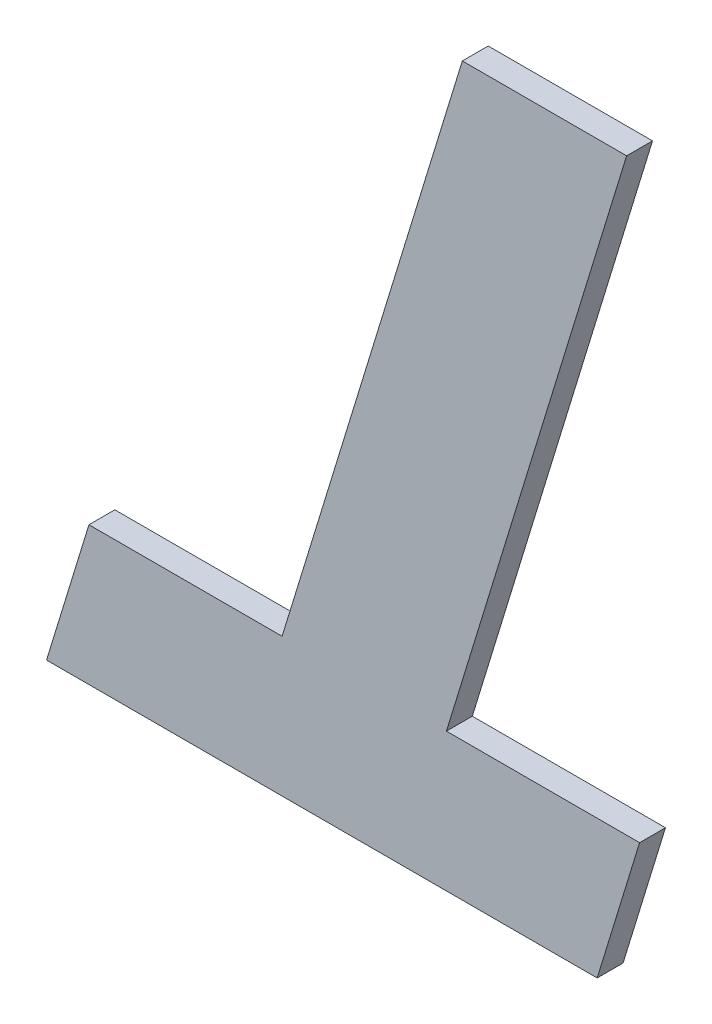
ISO-10303-21;
HEADER;
FILE_DESCRIPTION(('STEP AP214'),'2;1');
FILE_NAME('part.step','',(''),(''),'','','');
FILE_SCHEMA(('AUTOMOTIVE_DESIGN { 1 0 10303 214 1 1 1 1 }'));
ENDSEC;
DATA;
#1=APPLICATION_CONTEXT('core data for automotive mechanical design processes');
#2=APPLICATION_PROTOCOL_DEFINITION('international standard','automotive_design',2000,#1);
#3=PRODUCT_CONTEXT('',#1,'mechanical');
#4=PRODUCT('Part','Part','',(#3));
#5=PRODUCT_RELATED_PRODUCT_CATEGORY('part','',(#4));
#6=PRODUCT_DEFINITION_FORMATION('','',#4);
#7=PRODUCT_DEFINITION_CONTEXT('part definition',#1,'design');
#8=PRODUCT_DEFINITION('design','',#6,#7);
#9=PRODUCT_DEFINITION_SHAPE('','',#8);
#10=(LENGTH_UNIT() NAMED_UNIT(*) SI_UNIT(.MILLI.,.METRE.));
#11=(NAMED_UNIT(*) PLANE_ANGLE_UNIT() SI_UNIT($,.RADIAN.));
#12=(NAMED_UNIT(*) SI_UNIT($,.STERADIAN.) SOLID_ANGLE_UNIT());
#13=UNCERTAINTY_MEASURE_WITH_UNIT(LENGTH_MEASURE(1.E-05),#10,'distance_accuracy_value','');
#14=(GEOMETRIC_REPRESENTATION_CONTEXT(3) GLOBAL_UNCERTAINTY_ASSIGNED_CONTEXT((#13)) GLOBAL_UNIT_ASSIGNED_CONTEXT((#10,
#11,#12)) REPRESENTATION_CONTEXT('',''));
#15=CARTESIAN_POINT('',(0.,0.,0.));
#16=DIRECTION('',(0.,0.,1.));
#17=DIRECTION('',(1.,0.,0.));
#18=AXIS2_PLACEMENT_3D('',#15,#16,#17);
#19=CARTESIAN_POINT('',(0.507935009014504,-1.956156289871,0.));
#20=DIRECTION('',(0.,1.,0.));
#21=DIRECTION('',(-1.,0.,0.));
#22=AXIS2_PLACEMENT_3D('',#19,#20,#21);
#23=PLANE('',#22);
#24=DIRECTION('',(1.,0.,0.));
#25=VECTOR('',#24,1.);
#26=CARTESIAN_POINT('',(-0.238437801624394,-1.956156289871,0.));
#27=LINE('',#26,#25);
#28=CARTESIAN_POINT('',(-0.238437801624394,-1.956156289871,0.));
#29=VERTEX_POINT('',#28);
#30=CARTESIAN_POINT('',(0.507935009014504,-1.956156289871,0.));
#31=VERTEX_POINT('',#30);
#32=EDGE_CURVE('E11',#29,#31,#27,.T.);
#33=ORIENTED_EDGE('',*,*,#32,.F.);
#34=DIRECTION('',(0.,0.,1.));
#35=VECTOR('',#34,1.);
#36=CARTESIAN_POINT('',(-0.238437801624394,-1.956156289871,0.));
#37=LINE('',#36,#35);
#38=CARTESIAN_POINT('',(-0.238437801624394,-1.956156289871,0.1));
#39=VERTEX_POINT('',#38);
#40=EDGE_CURVE('E24',#29,#39,#37,.T.);
#41=ORIENTED_EDGE('',*,*,#40,.T.);
#42=DIRECTION('',(-1.,0.,0.));
#43=VECTOR('',#42,1.);
#44=CARTESIAN_POINT('',(-0.238437801624394,-1.956156289871,0.1));
#45=LINE('',#44,#43);
#46=CARTESIAN_POINT('',(0.507935009014504,-1.956156289871,0.1));
#47=VERTEX_POINT('',#46);
#48=EDGE_CURVE('E100',#47,#39,#45,.T.);
#49=ORIENTED_EDGE('',*,*,#48,.F.);
#50=DIRECTION('',(0.,0.,1.));
#51=VECTOR('',#50,1.);
#52=CARTESIAN_POINT('',(0.507935009014504,-1.956156289871,0.));
#53=LINE('',#52,#51);
#54=EDGE_CURVE('E141',#31,#47,#53,.T.);
#55=ORIENTED_EDGE('',*,*,#54,.F.);
#56=EDGE_LOOP('',(#33,#41,#49,#55));
#57=FACE_BOUND('',#56,.T.);
#58=ADVANCED_FACE('F17',(#57),#23,.T.);
#59=CARTESIAN_POINT('',(0.344097074971819,-2.490905102371,0.));
#60=DIRECTION('',(0.956130206843128,-0.292942020820021,0.));
#61=DIRECTION('',(0.292942020820021,0.956130206843128,0.));
#62=AXIS2_PLACEMENT_3D('',#59,#60,#61);
#63=PLANE('',#62);
#64=DIRECTION('',(-0.292942020820021,-0.956130206843128,0.));
#65=VECTOR('',#64,1.);
#66=CARTESIAN_POINT('',(0.507935009014504,-1.956156289871,0.));
#67=LINE('',#66,#65);
#68=CARTESIAN_POINT('',(0.344097074971819,-2.490905102371,0.));
#69=VERTEX_POINT('',#68);
#70=EDGE_CURVE('E139',#31,#69,#67,.T.);
#71=ORIENTED_EDGE('',*,*,#70,.F.);
#72=ORIENTED_EDGE('',*,*,#54,.T.);
#73=DIRECTION('',(0.292942020820021,0.956130206843128,0.));
#74=VECTOR('',#73,1.);
#75=CARTESIAN_POINT('',(0.507935009014504,-1.956156289871,0.1));
#76=LINE('',#75,#74);
#77=CARTESIAN_POINT('',(0.344097074971819,-2.490905102371,0.1));
#78=VERTEX_POINT('',#77);
#79=EDGE_CURVE('E137',#78,#47,#76,.T.);
#80=ORIENTED_EDGE('',*,*,#79,.F.);
#81=DIRECTION('',(0.,0.,1.));
#82=VECTOR('',#81,1.);
#83=CARTESIAN_POINT('',(0.344097074971819,-2.490905102371,0.));
#84=LINE('',#83,#82);
#85=EDGE_CURVE('E134',#69,#78,#84,.T.);
#86=ORIENTED_EDGE('',*,*,#85,.F.);
#87=EDGE_LOOP('',(#71,#72,#80,#86));
#88=FACE_BOUND('',#87,.T.);
#89=ADVANCED_FACE('F163',(#88),#63,.T.);
#90=CARTESIAN_POINT('',(-1.783520540721,-2.490905102371,0.));
#91=DIRECTION('',(0.,-1.,0.));
#92=DIRECTION('',(1.,0.,0.));
#93=AXIS2_PLACEMENT_3D('',#90,#91,#92);
#94=PLANE('',#93);
#95=DIRECTION('',(-1.,0.,0.));
#96=VECTOR('',#95,1.);
#97=CARTESIAN_POINT('',(0.344097074971819,-2.490905102371,0.));
#98=LINE('',#97,#96);
#99=CARTESIAN_POINT('',(-1.783520540721,-2.490905102371,0.));
#100=VERTEX_POINT('',#99);
#101=EDGE_CURVE('E132',#69,#100,#98,.T.);
#102=ORIENTED_EDGE('',*,*,#101,.F.);
#103=ORIENTED_EDGE('',*,*,#85,.T.);
#104=DIRECTION('',(1.,0.,0.));
#105=VECTOR('',#104,1.);
#106=CARTESIAN_POINT('',(0.344097074971819,-2.490905102371,0.1));
#107=LINE('',#106,#105);
#108=CARTESIAN_POINT('',(-1.783520540721,-2.490905102371,0.1));
#109=VERTEX_POINT('',#108);
#110=EDGE_CURVE('E129',#109,#78,#107,.T.);
#111=ORIENTED_EDGE('',*,*,#110,.F.);
#112=DIRECTION('',(0.,0.,1.));
#113=VECTOR('',#112,1.);
#114=CARTESIAN_POINT('',(-1.783520540721,-2.490905102371,0.));
#115=LINE('',#114,#113);
#116=EDGE_CURVE('E126',#100,#109,#115,.T.);
#117=ORIENTED_EDGE('',*,*,#116,.F.);
#118=EDGE_LOOP('',(#102,#103,#111,#117));
#119=FACE_BOUND('',#118,.T.);
#120=ADVANCED_FACE('F159',(#119),#94,.T.);
#121=CARTESIAN_POINT('',(-1.619682606679,-1.956156289871,0.));
#122=DIRECTION('',(-0.956130206843128,0.292942020820022,0.));
#123=DIRECTION('',(-0.292942020820022,-0.956130206843128,0.));
#124=AXIS2_PLACEMENT_3D('',#121,#122,#123);
#125=PLANE('',#124);
#126=DIRECTION('',(0.292942020820022,0.956130206843128,0.));
#127=VECTOR('',#126,1.);
#128=CARTESIAN_POINT('',(-1.783520540721,-2.490905102371,0.));
#129=LINE('',#128,#127);
#130=CARTESIAN_POINT('',(-1.619682606679,-1.956156289871,0.));
#131=VERTEX_POINT('',#130);
#132=EDGE_CURVE('E124',#100,#131,#129,.T.);
#133=ORIENTED_EDGE('',*,*,#132,.F.);
#134=ORIENTED_EDGE('',*,*,#116,.T.);
#135=DIRECTION('',(-0.292942020820022,-0.956130206843128,0.));
#136=VECTOR('',#135,1.);
#137=CARTESIAN_POINT('',(-1.783520540721,-2.490905102371,0.1));
#138=LINE('',#137,#136);
#139=CARTESIAN_POINT('',(-1.619682606679,-1.956156289871,0.1));
#140=VERTEX_POINT('',#139);
#141=EDGE_CURVE('E121',#140,#109,#138,.T.);
#142=ORIENTED_EDGE('',*,*,#141,.F.);
#143=DIRECTION('',(0.,0.,1.));
#144=VECTOR('',#143,1.);
#145=CARTESIAN_POINT('',(-1.619682606679,-1.956156289871,0.));
#146=LINE('',#145,#144);
#147=EDGE_CURVE('E118',#131,#140,#146,.T.);
#148=ORIENTED_EDGE('',*,*,#147,.F.);
#149=EDGE_LOOP('',(#133,#134,#142,#148));
#150=FACE_BOUND('',#149,.T.);
#151=ADVANCED_FACE('F155',(#150),#125,.T.);
#152=CARTESIAN_POINT('',(-0.873309796039798,-1.956156289871,0.));
#153=DIRECTION('',(0.,1.,0.));
#154=DIRECTION('',(-1.,0.,0.));
#155=AXIS2_PLACEMENT_3D('',#152,#153,#154);
#156=PLANE('',#155);
#157=DIRECTION('',(1.,0.,0.));
#158=VECTOR('',#157,1.);
#159=CARTESIAN_POINT('',(-1.619682606679,-1.956156289871,0.));
#160=LINE('',#159,#158);
#161=CARTESIAN_POINT('',(-0.873309796039798,-1.956156289871,0.));
#162=VERTEX_POINT('',#161);
#163=EDGE_CURVE('E116',#131,#162,#160,.T.);
#164=ORIENTED_EDGE('',*,*,#163,.F.);
#165=ORIENTED_EDGE('',*,*,#147,.T.);
#166=DIRECTION('',(-1.,0.,0.));
#167=VECTOR('',#166,1.);
#168=CARTESIAN_POINT('',(-1.619682606679,-1.956156289871,0.1));
#169=LINE('',#168,#167);
#170=CARTESIAN_POINT('',(-0.873309796039798,-1.956156289871,0.1));
#171=VERTEX_POINT('',#170);
#172=EDGE_CURVE('E113',#171,#140,#169,.T.);
#173=ORIENTED_EDGE('',*,*,#172,.F.);
#174=DIRECTION('',(0.,0.,1.));
#175=VECTOR('',#174,1.);
#176=CARTESIAN_POINT('',(-0.873309796039798,-1.956156289871,0.));
#177=LINE('',#176,#175);
#178=EDGE_CURVE('E110',#162,#171,#177,.T.);
#179=ORIENTED_EDGE('',*,*,#178,.F.);
#180=EDGE_LOOP('',(#164,#165,#173,#179));
#181=FACE_BOUND('',#180,.T.);
#182=ADVANCED_FACE('F151',(#181),#156,.T.);
#183=CARTESIAN_POINT('',(-0.176998576358387,0.317095044971264,0.));
#184=DIRECTION('',(-0.956150738053338,0.292875000845167,0.));
#185=DIRECTION('',(-0.292875000845167,-0.956150738053338,0.));
#186=AXIS2_PLACEMENT_3D('',#183,#184,#185);
#187=PLANE('',#186);
#188=DIRECTION('',(0.292875000845167,0.956150738053338,0.));
#189=VECTOR('',#188,1.);
#190=CARTESIAN_POINT('',(-0.873309796039798,-1.956156289871,0.));
#191=LINE('',#190,#189);
#192=CARTESIAN_POINT('',(-0.176998576358387,0.317095044971264,0.));
#193=VERTEX_POINT('',#192);
#194=EDGE_CURVE('E108',#162,#193,#191,.T.);
#195=ORIENTED_EDGE('',*,*,#194,.F.);
#196=ORIENTED_EDGE('',*,*,#178,.T.);
#197=DIRECTION('',(-0.292875000845167,-0.956150738053338,0.));
#198=VECTOR('',#197,1.);
#199=CARTESIAN_POINT('',(-0.873309796039798,-1.956156289871,0.1));
#200=LINE('',#199,#198);
#201=CARTESIAN_POINT('',(-0.176998576358387,0.317095044971264,0.1));
#202=VERTEX_POINT('',#201);
#203=EDGE_CURVE('E106',#202,#171,#200,.T.);
#204=ORIENTED_EDGE('',*,*,#203,.F.);
#205=DIRECTION('',(0.,0.,1.));
#206=VECTOR('',#205,1.);
#207=CARTESIAN_POINT('',(-0.176998576358387,0.317095044971264,0.));
#208=LINE('',#207,#206);
#209=EDGE_CURVE('E85',#193,#202,#208,.T.);
#210=ORIENTED_EDGE('',*,*,#209,.F.);
#211=EDGE_LOOP('',(#195,#196,#204,#210));
#212=FACE_BOUND('',#211,.T.);
#213=ADVANCED_FACE('F149',(#212),#187,.T.);
#214=CARTESIAN_POINT('',(0.457873418057017,0.317095044971264,0.));
#215=DIRECTION('',(0.,1.,0.));
#216=DIRECTION('',(-1.,0.,0.));
#217=AXIS2_PLACEMENT_3D('',#214,#215,#216);
#218=PLANE('',#217);
#219=DIRECTION('',(1.,0.,0.));
#220=VECTOR('',#219,1.);
#221=CARTESIAN_POINT('',(-0.176998576358387,0.317095044971264,0.));
#222=LINE('',#221,#220);
#223=CARTESIAN_POINT('',(0.457873418057017,0.317095044971264,0.));
#224=VERTEX_POINT('',#223);
#225=EDGE_CURVE('E89',#193,#224,#222,.T.);
#226=ORIENTED_EDGE('',*,*,#225,.F.);
#227=ORIENTED_EDGE('',*,*,#209,.T.);
#228=DIRECTION('',(-1.,0.,0.));
#229=VECTOR('',#228,1.);
#230=CARTESIAN_POINT('',(-0.176998576358387,0.317095044971264,0.1));
#231=LINE('',#230,#229);
#232=CARTESIAN_POINT('',(0.457873418057017,0.317095044971264,0.1));
#233=VERTEX_POINT('',#232);
#234=EDGE_CURVE('E78',#233,#202,#231,.T.);
#235=ORIENTED_EDGE('',*,*,#234,.F.);
#236=DIRECTION('',(0.,0.,1.));
#237=VECTOR('',#236,1.);
#238=CARTESIAN_POINT('',(0.457873418057017,0.317095044971264,0.));
#239=LINE('',#238,#237);
#240=EDGE_CURVE('E82',#224,#233,#239,.T.);
#241=ORIENTED_EDGE('',*,*,#240,.F.);
#242=EDGE_LOOP('',(#226,#227,#235,#241));
#243=FACE_BOUND('',#242,.T.);
#244=ADVANCED_FACE('F81',(#243),#218,.T.);
#245=CARTESIAN_POINT('',(-0.238437801624394,-1.956156289871,0.));
#246=DIRECTION('',(0.956150738053338,-0.292875000845167,0.));
#247=DIRECTION('',(0.292875000845167,0.956150738053338,0.));
#248=AXIS2_PLACEMENT_3D('',#245,#246,#247);
#249=PLANE('',#248);
#250=DIRECTION('',(-0.292875000845167,-0.956150738053338,0.));
#251=VECTOR('',#250,1.);
#252=CARTESIAN_POINT('',(0.457873418057017,0.317095044971264,0.));
#253=LINE('',#252,#251);
#254=EDGE_CURVE('E95',#224,#29,#253,.T.);
#255=ORIENTED_EDGE('',*,*,#254,.F.);
#256=ORIENTED_EDGE('',*,*,#240,.T.);
#257=DIRECTION('',(0.292875000845167,0.956150738053338,0.));
#258=VECTOR('',#257,1.);
#259=CARTESIAN_POINT('',(0.457873418057017,0.317095044971264,0.1));
#260=LINE('',#259,#258);
#261=EDGE_CURVE('E94',#39,#233,#260,.T.);
#262=ORIENTED_EDGE('',*,*,#261,.F.);
#263=ORIENTED_EDGE('',*,*,#40,.F.);
#264=EDGE_LOOP('',(#255,#256,#262,#263));
#265=FACE_BOUND('',#264,.T.);
#266=ADVANCED_FACE('F93',(#265),#249,.T.);
#267=CARTESIAN_POINT('',(-0.39224806131124,-1.421930874063,0.));
#268=DIRECTION('',(0.,0.,1.));
#269=DIRECTION('',(1.,0.,0.));
#270=AXIS2_PLACEMENT_3D('',#267,#268,#269);
#271=PLANE('',#270);
#272=ORIENTED_EDGE('',*,*,#254,.T.);
#273=ORIENTED_EDGE('',*,*,#32,.T.);
#274=ORIENTED_EDGE('',*,*,#70,.T.);
#275=ORIENTED_EDGE('',*,*,#101,.T.);
#276=ORIENTED_EDGE('',*,*,#132,.T.);
#277=ORIENTED_EDGE('',*,*,#163,.T.);
#278=ORIENTED_EDGE('',*,*,#194,.T.);
#279=ORIENTED_EDGE('',*,*,#225,.T.);
#280=EDGE_LOOP('',(#272,#273,#274,#275,#276,#277,#278,#279));
#281=FACE_BOUND('',#280,.T.);
#282=ADVANCED_FACE('F144',(#281),#271,.F.);
#283=CARTESIAN_POINT('',(-0.39224806131124,-1.421930874063,0.1));
#284=DIRECTION('',(0.,0.,1.));
#285=DIRECTION('',(1.,0.,0.));
#286=AXIS2_PLACEMENT_3D('',#283,#284,#285);
#287=PLANE('',#286);
#288=ORIENTED_EDGE('',*,*,#261,.T.);
#289=ORIENTED_EDGE('',*,*,#234,.T.);
#290=ORIENTED_EDGE('',*,*,#203,.T.);
#291=ORIENTED_EDGE('',*,*,#172,.T.);
#292=ORIENTED_EDGE('',*,*,#141,.T.);
#293=ORIENTED_EDGE('',*,*,#110,.T.);
#294=ORIENTED_EDGE('',*,*,#79,.T.);
#295=ORIENTED_EDGE('',*,*,#48,.T.);
#296=EDGE_LOOP('',(#288,#289,#290,#291,#292,#293,#294,#295));
#297=FACE_BOUND('',#296,.T.);
#298=ADVANCED_FACE('F98',(#297),#287,.T.);
#299=CLOSED_SHELL('',(#58,#89,#120,#151,#182,#213,#244,#266,#282,#298));
#300=MANIFOLD_SOLID_BREP('B1',#299);
#301=ADVANCED_BREP_SHAPE_REPRESENTATION('',(#18,#300),#14);
#302=SHAPE_DEFINITION_REPRESENTATION(#9,#301);
ENDSEC;
END-ISO-10303-21;
